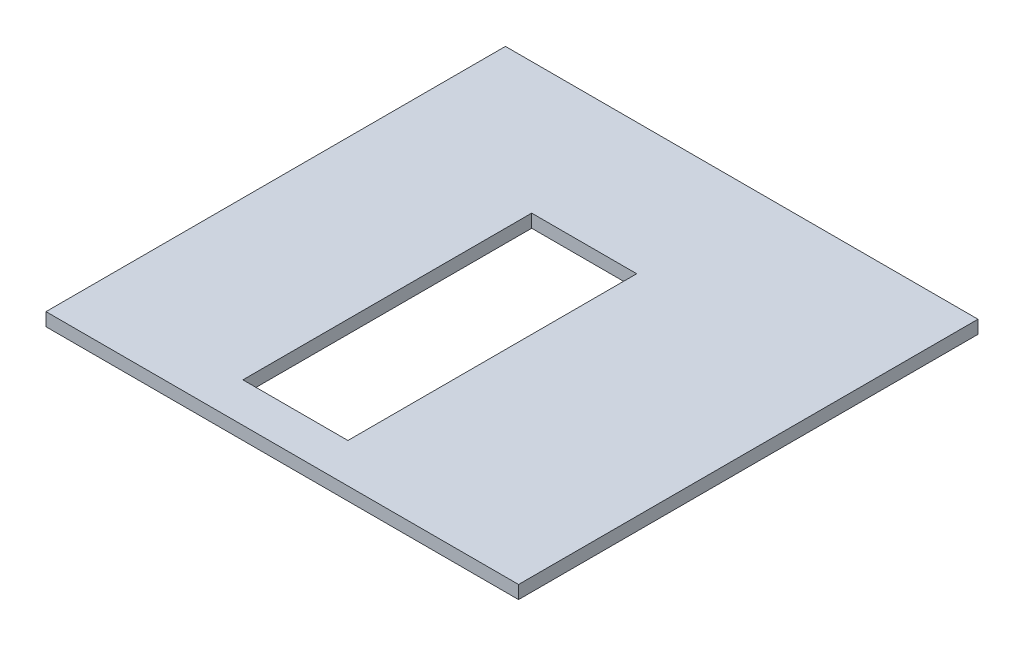
ISO-10303-21;
HEADER;
FILE_DESCRIPTION(('STEP AP214'),'2;1');
FILE_NAME('part.step','',(''),(''),'','','');
FILE_SCHEMA(('AUTOMOTIVE_DESIGN { 1 0 10303 214 1 1 1 1 }'));
ENDSEC;
DATA;
#1=APPLICATION_CONTEXT('core data for automotive mechanical design processes');
#2=APPLICATION_PROTOCOL_DEFINITION('international standard','automotive_design',2000,#1);
#3=PRODUCT_CONTEXT('',#1,'mechanical');
#4=PRODUCT('Part','Part','',(#3));
#5=PRODUCT_RELATED_PRODUCT_CATEGORY('part','',(#4));
#6=PRODUCT_DEFINITION_FORMATION('','',#4);
#7=PRODUCT_DEFINITION_CONTEXT('part definition',#1,'design');
#8=PRODUCT_DEFINITION('design','',#6,#7);
#9=PRODUCT_DEFINITION_SHAPE('','',#8);
#10=(LENGTH_UNIT() NAMED_UNIT(*) SI_UNIT(.MILLI.,.METRE.));
#11=(NAMED_UNIT(*) PLANE_ANGLE_UNIT() SI_UNIT($,.RADIAN.));
#12=(NAMED_UNIT(*) SI_UNIT($,.STERADIAN.) SOLID_ANGLE_UNIT());
#13=UNCERTAINTY_MEASURE_WITH_UNIT(LENGTH_MEASURE(1.E-05),#10,'distance_accuracy_value','');
#14=(GEOMETRIC_REPRESENTATION_CONTEXT(3) GLOBAL_UNCERTAINTY_ASSIGNED_CONTEXT((#13)) GLOBAL_UNIT_ASSIGNED_CONTEXT((#10,
#11,#12)) REPRESENTATION_CONTEXT('',''));
#15=CARTESIAN_POINT('',(0.,0.,0.));
#16=DIRECTION('',(0.,0.,1.));
#17=DIRECTION('',(1.,0.,0.));
#18=AXIS2_PLACEMENT_3D('',#15,#16,#17);
#19=CARTESIAN_POINT('',(0.,10.,0.));
#20=DIRECTION('',(0.,1.,0.));
#21=DIRECTION('',(0.,0.,1.));
#22=AXIS2_PLACEMENT_3D('',#19,#20,#21);
#23=PLANE('',#22);
#24=DIRECTION('',(0.,0.,-1.));
#25=VECTOR('',#24,1.);
#26=CARTESIAN_POINT('',(180.,10.,-175.));
#27=LINE('',#26,#25);
#28=CARTESIAN_POINT('',(180.,10.,175.));
#29=VERTEX_POINT('',#28);
#30=CARTESIAN_POINT('',(180.,10.,-175.));
#31=VERTEX_POINT('',#30);
#32=EDGE_CURVE('E136',#29,#31,#27,.T.);
#33=ORIENTED_EDGE('',*,*,#32,.T.);
#34=DIRECTION('',(-1.,0.,0.));
#35=VECTOR('',#34,1.);
#36=CARTESIAN_POINT('',(-180.,10.,-175.));
#37=LINE('',#36,#35);
#38=CARTESIAN_POINT('',(-180.,10.,-175.));
#39=VERTEX_POINT('',#38);
#40=EDGE_CURVE('E139',#31,#39,#37,.T.);
#41=ORIENTED_EDGE('',*,*,#40,.T.);
#42=DIRECTION('',(0.,0.,1.));
#43=VECTOR('',#42,1.);
#44=CARTESIAN_POINT('',(-180.,10.,-175.));
#45=LINE('',#44,#43);
#46=CARTESIAN_POINT('',(-180.,10.,175.));
#47=VERTEX_POINT('',#46);
#48=EDGE_CURVE('E142',#39,#47,#45,.T.);
#49=ORIENTED_EDGE('',*,*,#48,.T.);
#50=DIRECTION('',(1.,0.,0.));
#51=VECTOR('',#50,1.);
#52=CARTESIAN_POINT('',(-180.,10.,175.));
#53=LINE('',#52,#51);
#54=EDGE_CURVE('E144',#47,#29,#53,.T.);
#55=ORIENTED_EDGE('',*,*,#54,.T.);
#56=EDGE_LOOP('',(#33,#41,#49,#55));
#57=FACE_BOUND('',#56,.T.);
#58=DIRECTION('',(-1.,0.,0.));
#59=VECTOR('',#58,1.);
#60=CARTESIAN_POINT('',(-60.,10.,-75.));
#61=LINE('',#60,#59);
#62=CARTESIAN_POINT('',(20.,10.,-75.));
#63=VERTEX_POINT('',#62);
#64=CARTESIAN_POINT('',(-60.,10.,-75.));
#65=VERTEX_POINT('',#64);
#66=EDGE_CURVE('E108',#63,#65,#61,.T.);
#67=ORIENTED_EDGE('',*,*,#66,.F.);
#68=DIRECTION('',(0.,0.,-1.));
#69=VECTOR('',#68,1.);
#70=CARTESIAN_POINT('',(20.,10.,-75.));
#71=LINE('',#70,#69);
#72=CARTESIAN_POINT('',(20.,10.,145.));
#73=VERTEX_POINT('',#72);
#74=EDGE_CURVE('E100',#73,#63,#71,.T.);
#75=ORIENTED_EDGE('',*,*,#74,.F.);
#76=DIRECTION('',(1.,0.,0.));
#77=VECTOR('',#76,1.);
#78=CARTESIAN_POINT('',(-60.,10.,145.));
#79=LINE('',#78,#77);
#80=CARTESIAN_POINT('',(-60.,10.,145.));
#81=VERTEX_POINT('',#80);
#82=EDGE_CURVE('E122',#81,#73,#79,.T.);
#83=ORIENTED_EDGE('',*,*,#82,.F.);
#84=DIRECTION('',(0.,0.,1.));
#85=VECTOR('',#84,1.);
#86=CARTESIAN_POINT('',(-60.,10.,-75.));
#87=LINE('',#86,#85);
#88=EDGE_CURVE('E120',#65,#81,#87,.T.);
#89=ORIENTED_EDGE('',*,*,#88,.F.);
#90=EDGE_LOOP('',(#67,#75,#83,#89));
#91=FACE_BOUND('',#90,.T.);
#92=ADVANCED_FACE('F35',(#57,#91),#23,.T.);
#93=CARTESIAN_POINT('',(0.,0.,0.));
#94=DIRECTION('',(0.,1.,0.));
#95=DIRECTION('',(0.,0.,1.));
#96=AXIS2_PLACEMENT_3D('',#93,#94,#95);
#97=PLANE('',#96);
#98=DIRECTION('',(0.,0.,-1.));
#99=VECTOR('',#98,1.);
#100=CARTESIAN_POINT('',(180.,0.,-175.));
#101=LINE('',#100,#99);
#102=CARTESIAN_POINT('',(180.,0.,175.));
#103=VERTEX_POINT('',#102);
#104=CARTESIAN_POINT('',(180.,0.,-175.));
#105=VERTEX_POINT('',#104);
#106=EDGE_CURVE('E116',#103,#105,#101,.T.);
#107=ORIENTED_EDGE('',*,*,#106,.F.);
#108=DIRECTION('',(1.,0.,0.));
#109=VECTOR('',#108,1.);
#110=CARTESIAN_POINT('',(-180.,0.,175.));
#111=LINE('',#110,#109);
#112=CARTESIAN_POINT('',(-180.,0.,175.));
#113=VERTEX_POINT('',#112);
#114=EDGE_CURVE('E140',#113,#103,#111,.T.);
#115=ORIENTED_EDGE('',*,*,#114,.F.);
#116=DIRECTION('',(0.,0.,1.));
#117=VECTOR('',#116,1.);
#118=CARTESIAN_POINT('',(-180.,0.,-175.));
#119=LINE('',#118,#117);
#120=CARTESIAN_POINT('',(-180.,0.,-175.));
#121=VERTEX_POINT('',#120);
#122=EDGE_CURVE('E151',#121,#113,#119,.T.);
#123=ORIENTED_EDGE('',*,*,#122,.F.);
#124=DIRECTION('',(-1.,0.,0.));
#125=VECTOR('',#124,1.);
#126=CARTESIAN_POINT('',(-180.,0.,-175.));
#127=LINE('',#126,#125);
#128=EDGE_CURVE('E149',#105,#121,#127,.T.);
#129=ORIENTED_EDGE('',*,*,#128,.F.);
#130=EDGE_LOOP('',(#107,#115,#123,#129));
#131=FACE_BOUND('',#130,.T.);
#132=DIRECTION('',(0.,0.,-1.));
#133=VECTOR('',#132,1.);
#134=CARTESIAN_POINT('',(20.,0.,-75.));
#135=LINE('',#134,#133);
#136=CARTESIAN_POINT('',(20.,0.,145.));
#137=VERTEX_POINT('',#136);
#138=CARTESIAN_POINT('',(20.,0.,-75.));
#139=VERTEX_POINT('',#138);
#140=EDGE_CURVE('E58',#137,#139,#135,.T.);
#141=ORIENTED_EDGE('',*,*,#140,.T.);
#142=DIRECTION('',(-1.,0.,0.));
#143=VECTOR('',#142,1.);
#144=CARTESIAN_POINT('',(-60.,0.,-75.));
#145=LINE('',#144,#143);
#146=CARTESIAN_POINT('',(-60.,0.,-75.));
#147=VERTEX_POINT('',#146);
#148=EDGE_CURVE('E115',#139,#147,#145,.T.);
#149=ORIENTED_EDGE('',*,*,#148,.T.);
#150=DIRECTION('',(0.,0.,1.));
#151=VECTOR('',#150,1.);
#152=CARTESIAN_POINT('',(-60.,0.,-75.));
#153=LINE('',#152,#151);
#154=CARTESIAN_POINT('',(-60.,0.,145.));
#155=VERTEX_POINT('',#154);
#156=EDGE_CURVE('E128',#147,#155,#153,.T.);
#157=ORIENTED_EDGE('',*,*,#156,.T.);
#158=DIRECTION('',(1.,0.,0.));
#159=VECTOR('',#158,1.);
#160=CARTESIAN_POINT('',(-60.,0.,145.));
#161=LINE('',#160,#159);
#162=EDGE_CURVE('E109',#155,#137,#161,.T.);
#163=ORIENTED_EDGE('',*,*,#162,.T.);
#164=EDGE_LOOP('',(#141,#149,#157,#163));
#165=FACE_BOUND('',#164,.T.);
#166=ADVANCED_FACE('F169',(#131,#165),#97,.F.);
#167=CARTESIAN_POINT('',(180.,10.,-175.));
#168=DIRECTION('',(-1.,0.,0.));
#169=DIRECTION('',(0.,0.,1.));
#170=AXIS2_PLACEMENT_3D('',#167,#168,#169);
#171=PLANE('',#170);
#172=ORIENTED_EDGE('',*,*,#106,.T.);
#173=DIRECTION('',(0.,-1.,0.));
#174=VECTOR('',#173,1.);
#175=CARTESIAN_POINT('',(180.,10.,-175.));
#176=LINE('',#175,#174);
#177=EDGE_CURVE('E11',#31,#105,#176,.T.);
#178=ORIENTED_EDGE('',*,*,#177,.F.);
#179=ORIENTED_EDGE('',*,*,#32,.F.);
#180=DIRECTION('',(0.,-1.,0.));
#181=VECTOR('',#180,1.);
#182=CARTESIAN_POINT('',(180.,10.,175.));
#183=LINE('',#182,#181);
#184=EDGE_CURVE('E146',#29,#103,#183,.T.);
#185=ORIENTED_EDGE('',*,*,#184,.T.);
#186=EDGE_LOOP('',(#172,#178,#179,#185));
#187=FACE_BOUND('',#186,.T.);
#188=ADVANCED_FACE('F37',(#187),#171,.F.);
#189=CARTESIAN_POINT('',(-180.,10.,-175.));
#190=DIRECTION('',(0.,0.,1.));
#191=DIRECTION('',(1.,0.,0.));
#192=AXIS2_PLACEMENT_3D('',#189,#190,#191);
#193=PLANE('',#192);
#194=ORIENTED_EDGE('',*,*,#128,.T.);
#195=DIRECTION('',(0.,-1.,0.));
#196=VECTOR('',#195,1.);
#197=CARTESIAN_POINT('',(-180.,10.,-175.));
#198=LINE('',#197,#196);
#199=EDGE_CURVE('E43',#39,#121,#198,.T.);
#200=ORIENTED_EDGE('',*,*,#199,.F.);
#201=ORIENTED_EDGE('',*,*,#40,.F.);
#202=ORIENTED_EDGE('',*,*,#177,.T.);
#203=EDGE_LOOP('',(#194,#200,#201,#202));
#204=FACE_BOUND('',#203,.T.);
#205=ADVANCED_FACE('F179',(#204),#193,.F.);
#206=CARTESIAN_POINT('',(-180.,10.,-175.));
#207=DIRECTION('',(1.,0.,0.));
#208=DIRECTION('',(0.,0.,-1.));
#209=AXIS2_PLACEMENT_3D('',#206,#207,#208);
#210=PLANE('',#209);
#211=ORIENTED_EDGE('',*,*,#122,.T.);
#212=DIRECTION('',(0.,-1.,0.));
#213=VECTOR('',#212,1.);
#214=CARTESIAN_POINT('',(-180.,10.,175.));
#215=LINE('',#214,#213);
#216=EDGE_CURVE('E156',#47,#113,#215,.T.);
#217=ORIENTED_EDGE('',*,*,#216,.F.);
#218=ORIENTED_EDGE('',*,*,#48,.F.);
#219=ORIENTED_EDGE('',*,*,#199,.T.);
#220=EDGE_LOOP('',(#211,#217,#218,#219));
#221=FACE_BOUND('',#220,.T.);
#222=ADVANCED_FACE('F163',(#221),#210,.F.);
#223=CARTESIAN_POINT('',(-180.,10.,175.));
#224=DIRECTION('',(0.,0.,-1.));
#225=DIRECTION('',(-1.,0.,0.));
#226=AXIS2_PLACEMENT_3D('',#223,#224,#225);
#227=PLANE('',#226);
#228=ORIENTED_EDGE('',*,*,#114,.T.);
#229=ORIENTED_EDGE('',*,*,#184,.F.);
#230=ORIENTED_EDGE('',*,*,#54,.F.);
#231=ORIENTED_EDGE('',*,*,#216,.T.);
#232=EDGE_LOOP('',(#228,#229,#230,#231));
#233=FACE_BOUND('',#232,.T.);
#234=ADVANCED_FACE('F173',(#233),#227,.F.);
#235=CARTESIAN_POINT('',(20.,10.,-75.));
#236=DIRECTION('',(-1.,0.,0.));
#237=DIRECTION('',(0.,0.,1.));
#238=AXIS2_PLACEMENT_3D('',#235,#236,#237);
#239=PLANE('',#238);
#240=ORIENTED_EDGE('',*,*,#140,.F.);
#241=DIRECTION('',(0.,-1.,0.));
#242=VECTOR('',#241,1.);
#243=CARTESIAN_POINT('',(20.,10.,145.));
#244=LINE('',#243,#242);
#245=EDGE_CURVE('E104',#73,#137,#244,.T.);
#246=ORIENTED_EDGE('',*,*,#245,.F.);
#247=ORIENTED_EDGE('',*,*,#74,.T.);
#248=DIRECTION('',(0.,-1.,0.));
#249=VECTOR('',#248,1.);
#250=CARTESIAN_POINT('',(20.,10.,-75.));
#251=LINE('',#250,#249);
#252=EDGE_CURVE('E103',#63,#139,#251,.T.);
#253=ORIENTED_EDGE('',*,*,#252,.T.);
#254=EDGE_LOOP('',(#240,#246,#247,#253));
#255=FACE_BOUND('',#254,.T.);
#256=ADVANCED_FACE('F102',(#255),#239,.T.);
#257=CARTESIAN_POINT('',(-60.,10.,-75.));
#258=DIRECTION('',(0.,0.,1.));
#259=DIRECTION('',(1.,0.,0.));
#260=AXIS2_PLACEMENT_3D('',#257,#258,#259);
#261=PLANE('',#260);
#262=ORIENTED_EDGE('',*,*,#148,.F.);
#263=ORIENTED_EDGE('',*,*,#252,.F.);
#264=ORIENTED_EDGE('',*,*,#66,.T.);
#265=DIRECTION('',(0.,-1.,0.));
#266=VECTOR('',#265,1.);
#267=CARTESIAN_POINT('',(-60.,10.,-75.));
#268=LINE('',#267,#266);
#269=EDGE_CURVE('E117',#65,#147,#268,.T.);
#270=ORIENTED_EDGE('',*,*,#269,.T.);
#271=EDGE_LOOP('',(#262,#263,#264,#270));
#272=FACE_BOUND('',#271,.T.);
#273=ADVANCED_FACE('F112',(#272),#261,.T.);
#274=CARTESIAN_POINT('',(-60.,10.,-75.));
#275=DIRECTION('',(1.,0.,0.));
#276=DIRECTION('',(0.,0.,-1.));
#277=AXIS2_PLACEMENT_3D('',#274,#275,#276);
#278=PLANE('',#277);
#279=ORIENTED_EDGE('',*,*,#156,.F.);
#280=ORIENTED_EDGE('',*,*,#269,.F.);
#281=ORIENTED_EDGE('',*,*,#88,.T.);
#282=DIRECTION('',(0.,-1.,0.));
#283=VECTOR('',#282,1.);
#284=CARTESIAN_POINT('',(-60.,10.,145.));
#285=LINE('',#284,#283);
#286=EDGE_CURVE('E50',#81,#155,#285,.T.);
#287=ORIENTED_EDGE('',*,*,#286,.T.);
#288=EDGE_LOOP('',(#279,#280,#281,#287));
#289=FACE_BOUND('',#288,.T.);
#290=ADVANCED_FACE('F202',(#289),#278,.T.);
#291=CARTESIAN_POINT('',(-60.,10.,145.));
#292=DIRECTION('',(0.,0.,-1.));
#293=DIRECTION('',(-1.,0.,0.));
#294=AXIS2_PLACEMENT_3D('',#291,#292,#293);
#295=PLANE('',#294);
#296=ORIENTED_EDGE('',*,*,#162,.F.);
#297=ORIENTED_EDGE('',*,*,#286,.F.);
#298=ORIENTED_EDGE('',*,*,#82,.T.);
#299=ORIENTED_EDGE('',*,*,#245,.T.);
#300=EDGE_LOOP('',(#296,#297,#298,#299));
#301=FACE_BOUND('',#300,.T.);
#302=ADVANCED_FACE('F206',(#301),#295,.T.);
#303=CLOSED_SHELL('',(#92,#166,#188,#205,#222,#234,#256,#273,#290,#302));
#304=MANIFOLD_SOLID_BREP('B2',#303);
#305=ADVANCED_BREP_SHAPE_REPRESENTATION('',(#18,#304),#14);
#306=SHAPE_DEFINITION_REPRESENTATION(#9,#305);
ENDSEC;
END-ISO-10303-21;
